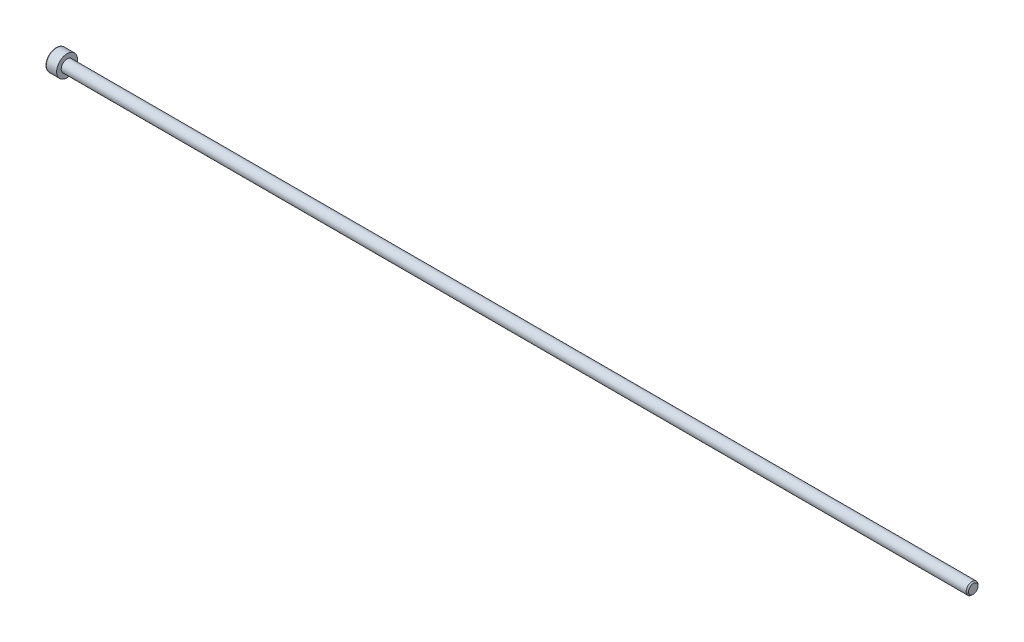
ISO-10303-21;
HEADER;
FILE_DESCRIPTION(('STEP AP214'),'2;1');
FILE_NAME('part.step','',(''),(''),'','','');
FILE_SCHEMA(('AUTOMOTIVE_DESIGN { 1 0 10303 214 1 1 1 1 }'));
ENDSEC;
DATA;
#1=APPLICATION_CONTEXT('core data for automotive mechanical design processes');
#2=APPLICATION_PROTOCOL_DEFINITION('international standard','automotive_design',2000,#1);
#3=PRODUCT_CONTEXT('',#1,'mechanical');
#4=PRODUCT('Part','Part','',(#3));
#5=PRODUCT_RELATED_PRODUCT_CATEGORY('part','',(#4));
#6=PRODUCT_DEFINITION_FORMATION('','',#4);
#7=PRODUCT_DEFINITION_CONTEXT('part definition',#1,'design');
#8=PRODUCT_DEFINITION('design','',#6,#7);
#9=PRODUCT_DEFINITION_SHAPE('','',#8);
#10=(LENGTH_UNIT() NAMED_UNIT(*) SI_UNIT(.MILLI.,.METRE.));
#11=(NAMED_UNIT(*) PLANE_ANGLE_UNIT() SI_UNIT($,.RADIAN.));
#12=(NAMED_UNIT(*) SI_UNIT($,.STERADIAN.) SOLID_ANGLE_UNIT());
#13=UNCERTAINTY_MEASURE_WITH_UNIT(LENGTH_MEASURE(1.E-05),#10,'distance_accuracy_value','');
#14=(GEOMETRIC_REPRESENTATION_CONTEXT(3) GLOBAL_UNCERTAINTY_ASSIGNED_CONTEXT((#13)) GLOBAL_UNIT_ASSIGNED_CONTEXT((#10,
#11,#12)) REPRESENTATION_CONTEXT('',''));
#15=CARTESIAN_POINT('',(0.,0.,0.));
#16=DIRECTION('',(0.,0.,1.));
#17=DIRECTION('',(1.,0.,0.));
#18=AXIS2_PLACEMENT_3D('',#15,#16,#17);
#19=CARTESIAN_POINT('',(0.,2.66,0.));
#20=DIRECTION('',(1.,0.,0.));
#21=DIRECTION('',(0.,1.,0.));
#22=AXIS2_PLACEMENT_3D('',#19,#20,#21);
#23=PLANE('',#22);
#24=CARTESIAN_POINT('',(0.,0.,0.));
#25=DIRECTION('',(-1.,0.,0.));
#26=DIRECTION('',(0.,-1.,0.));
#27=AXIS2_PLACEMENT_3D('',#24,#25,#26);
#28=CIRCLE('',#27,1.5);
#29=CARTESIAN_POINT('',(0.,-1.5,0.));
#30=VERTEX_POINT('',#29);
#31=EDGE_CURVE('E144',#30,#30,#28,.T.);
#32=ORIENTED_EDGE('',*,*,#31,.T.);
#33=EDGE_LOOP('',(#32));
#34=FACE_BOUND('',#33,.T.);
#35=CARTESIAN_POINT('',(0.,0.,0.));
#36=DIRECTION('',(-1.,0.,0.));
#37=DIRECTION('',(0.,-1.,0.));
#38=AXIS2_PLACEMENT_3D('',#35,#36,#37);
#39=CIRCLE('',#38,2.66);
#40=CARTESIAN_POINT('',(0.,-2.66,0.));
#41=VERTEX_POINT('',#40);
#42=EDGE_CURVE('E136',#41,#41,#39,.T.);
#43=ORIENTED_EDGE('',*,*,#42,.F.);
#44=EDGE_LOOP('',(#43));
#45=FACE_BOUND('',#44,.T.);
#46=ADVANCED_FACE('F34',(#34,#45),#23,.T.);
#47=CARTESIAN_POINT('',(0.,0.,0.));
#48=DIRECTION('',(-1.,0.,0.));
#49=DIRECTION('',(0.,-1.,0.));
#50=AXIS2_PLACEMENT_3D('',#47,#48,#49);
#51=CYLINDRICAL_SURFACE('',#50,1.49999999999999);
#52=CARTESIAN_POINT('',(229.6935,0.,0.));
#53=DIRECTION('',(1.,0.,0.));
#54=DIRECTION('',(0.,1.,0.));
#55=AXIS2_PLACEMENT_3D('',#52,#53,#54);
#56=CIRCLE('',#55,1.49999999999999);
#57=CARTESIAN_POINT('',(229.6935,1.49999999999999,0.));
#58=VERTEX_POINT('',#57);
#59=EDGE_CURVE('E42',#58,#58,#56,.F.);
#60=ORIENTED_EDGE('',*,*,#59,.T.);
#61=EDGE_LOOP('',(#60));
#62=FACE_BOUND('',#61,.T.);
#63=ORIENTED_EDGE('',*,*,#31,.F.);
#64=EDGE_LOOP('',(#63));
#65=FACE_BOUND('',#64,.T.);
#66=ADVANCED_FACE('F155',(#62,#65),#51,.T.);
#67=CARTESIAN_POINT('',(230.,0.,0.));
#68=DIRECTION('',(1.,0.,0.));
#69=DIRECTION('',(0.,1.,0.));
#70=AXIS2_PLACEMENT_3D('',#67,#68,#69);
#71=PLANE('',#70);
#72=CARTESIAN_POINT('',(230.,0.,0.));
#73=DIRECTION('',(1.,0.,0.));
#74=DIRECTION('',(0.,1.,0.));
#75=AXIS2_PLACEMENT_3D('',#72,#73,#74);
#76=CIRCLE('',#75,1.19350000000001);
#77=CARTESIAN_POINT('',(230.,1.19350000000001,0.));
#78=VERTEX_POINT('',#77);
#79=EDGE_CURVE('E11',#78,#78,#76,.T.);
#80=ORIENTED_EDGE('',*,*,#79,.T.);
#81=EDGE_LOOP('',(#80));
#82=FACE_BOUND('',#81,.T.);
#83=ADVANCED_FACE('F172',(#82),#71,.T.);
#84=CARTESIAN_POINT('',(-2.86,0.,0.));
#85=DIRECTION('',(-1.,0.,0.));
#86=DIRECTION('',(0.,-1.,0.));
#87=AXIS2_PLACEMENT_3D('',#84,#85,#86);
#88=PLANE('',#87);
#89=CARTESIAN_POINT('',(-2.86,0.,0.));
#90=DIRECTION('',(-1.,0.,0.));
#91=DIRECTION('',(0.,-1.,0.));
#92=AXIS2_PLACEMENT_3D('',#89,#90,#91);
#93=CIRCLE('',#92,2.394);
#94=CARTESIAN_POINT('',(-2.86,-2.394,0.));
#95=VERTEX_POINT('',#94);
#96=EDGE_CURVE('E147',#95,#95,#93,.T.);
#97=ORIENTED_EDGE('',*,*,#96,.T.);
#98=EDGE_LOOP('',(#97));
#99=FACE_BOUND('',#98,.T.);
#100=DIRECTION('',(0.,-1.,0.));
#101=VECTOR('',#100,1.);
#102=CARTESIAN_POINT('',(-2.86,0.721687836487032,-1.25));
#103=LINE('',#102,#101);
#104=CARTESIAN_POINT('',(-2.86,0.721687836487032,-1.25));
#105=VERTEX_POINT('',#104);
#106=CARTESIAN_POINT('',(-2.86,-0.721687836487033,-1.25));
#107=VERTEX_POINT('',#106);
#108=EDGE_CURVE('E49',#105,#107,#103,.T.);
#109=ORIENTED_EDGE('',*,*,#108,.F.);
#110=DIRECTION('',(0.,-0.5,-0.866025403784439));
#111=VECTOR('',#110,1.);
#112=CARTESIAN_POINT('',(-2.86,1.44337567297406,0.));
#113=LINE('',#112,#111);
#114=CARTESIAN_POINT('',(-2.86,1.44337567297406,0.));
#115=VERTEX_POINT('',#114);
#116=EDGE_CURVE('E132',#115,#105,#113,.T.);
#117=ORIENTED_EDGE('',*,*,#116,.F.);
#118=DIRECTION('',(0.,0.499999999999999,-0.866025403784439));
#119=VECTOR('',#118,1.);
#120=CARTESIAN_POINT('',(-2.86,0.721687836487033,1.25));
#121=LINE('',#120,#119);
#122=CARTESIAN_POINT('',(-2.86,0.721687836487033,1.25));
#123=VERTEX_POINT('',#122);
#124=EDGE_CURVE('E130',#123,#115,#121,.T.);
#125=ORIENTED_EDGE('',*,*,#124,.F.);
#126=DIRECTION('',(0.,1.,0.));
#127=VECTOR('',#126,1.);
#128=CARTESIAN_POINT('',(-2.86,-0.721687836487031,1.25));
#129=LINE('',#128,#127);
#130=CARTESIAN_POINT('',(-2.86,-0.721687836487031,1.25));
#131=VERTEX_POINT('',#130);
#132=EDGE_CURVE('E97',#131,#123,#129,.T.);
#133=ORIENTED_EDGE('',*,*,#132,.F.);
#134=DIRECTION('',(0.,0.5,0.866025403784438));
#135=VECTOR('',#134,1.);
#136=CARTESIAN_POINT('',(-2.86,-1.44337567297406,0.));
#137=LINE('',#136,#135);
#138=CARTESIAN_POINT('',(-2.86,-1.44337567297406,0.));
#139=VERTEX_POINT('',#138);
#140=EDGE_CURVE('E126',#139,#131,#137,.T.);
#141=ORIENTED_EDGE('',*,*,#140,.F.);
#142=DIRECTION('',(0.,-0.499999999999999,0.866025403784439));
#143=VECTOR('',#142,1.);
#144=CARTESIAN_POINT('',(-2.86,-0.721687836487033,-1.25));
#145=LINE('',#144,#143);
#146=EDGE_CURVE('E123',#107,#139,#145,.T.);
#147=ORIENTED_EDGE('',*,*,#146,.F.);
#148=EDGE_LOOP('',(#109,#117,#125,#133,#141,#147));
#149=FACE_BOUND('',#148,.T.);
#150=ADVANCED_FACE('F178',(#99,#149),#88,.T.);
#151=CARTESIAN_POINT('',(0.,0.,0.));
#152=DIRECTION('',(-1.,0.,0.));
#153=DIRECTION('',(0.,-1.,0.));
#154=AXIS2_PLACEMENT_3D('',#151,#152,#153);
#155=CYLINDRICAL_SURFACE('',#154,2.66);
#156=CARTESIAN_POINT('',(-2.594,0.,0.));
#157=DIRECTION('',(-1.,0.,0.));
#158=DIRECTION('',(0.,-1.,0.));
#159=AXIS2_PLACEMENT_3D('',#156,#157,#158);
#160=CIRCLE('',#159,2.66);
#161=CARTESIAN_POINT('',(-2.594,-2.66,0.));
#162=VERTEX_POINT('',#161);
#163=EDGE_CURVE('E150',#162,#162,#160,.F.);
#164=ORIENTED_EDGE('',*,*,#163,.T.);
#165=EDGE_LOOP('',(#164));
#166=FACE_BOUND('',#165,.T.);
#167=ORIENTED_EDGE('',*,*,#42,.T.);
#168=EDGE_LOOP('',(#167));
#169=FACE_BOUND('',#168,.T.);
#170=ADVANCED_FACE('F182',(#166,#169),#155,.T.);
#171=CARTESIAN_POINT('',(-1.56,0.721687836487032,-1.25));
#172=DIRECTION('',(0.,0.,-1.));
#173=DIRECTION('',(-1.,0.,0.));
#174=AXIS2_PLACEMENT_3D('',#171,#172,#173);
#175=PLANE('',#174);
#176=ORIENTED_EDGE('',*,*,#108,.T.);
#177=DIRECTION('',(-1.,0.,0.));
#178=VECTOR('',#177,1.);
#179=CARTESIAN_POINT('',(-1.56,-0.721687836487033,-1.25));
#180=LINE('',#179,#178);
#181=CARTESIAN_POINT('',(-1.56,-0.721687836487033,-1.25));
#182=VERTEX_POINT('',#181);
#183=EDGE_CURVE('E79',#182,#107,#180,.T.);
#184=ORIENTED_EDGE('',*,*,#183,.F.);
#185=DIRECTION('',(0.,-1.,0.));
#186=VECTOR('',#185,1.);
#187=CARTESIAN_POINT('',(-1.56,0.721687836487032,-1.25));
#188=LINE('',#187,#186);
#189=CARTESIAN_POINT('',(-1.56,0.721687836487032,-1.25));
#190=VERTEX_POINT('',#189);
#191=EDGE_CURVE('E134',#190,#182,#188,.T.);
#192=ORIENTED_EDGE('',*,*,#191,.F.);
#193=DIRECTION('',(-1.,0.,0.));
#194=VECTOR('',#193,1.);
#195=CARTESIAN_POINT('',(-1.56,0.721687836487032,-1.25));
#196=LINE('',#195,#194);
#197=EDGE_CURVE('E57',#190,#105,#196,.T.);
#198=ORIENTED_EDGE('',*,*,#197,.T.);
#199=EDGE_LOOP('',(#176,#184,#192,#198));
#200=FACE_BOUND('',#199,.T.);
#201=ADVANCED_FACE('F186',(#200),#175,.F.);
#202=CARTESIAN_POINT('',(-1.56,1.44337567297406,0.));
#203=DIRECTION('',(0.,0.866025403784439,-0.5));
#204=DIRECTION('',(0.,0.5,0.866025403784439));
#205=AXIS2_PLACEMENT_3D('',#202,#203,#204);
#206=PLANE('',#205);
#207=ORIENTED_EDGE('',*,*,#116,.T.);
#208=ORIENTED_EDGE('',*,*,#197,.F.);
#209=DIRECTION('',(0.,-0.5,-0.866025403784439));
#210=VECTOR('',#209,1.);
#211=CARTESIAN_POINT('',(-1.56,1.44337567297406,0.));
#212=LINE('',#211,#210);
#213=CARTESIAN_POINT('',(-1.56,1.44337567297406,0.));
#214=VERTEX_POINT('',#213);
#215=EDGE_CURVE('E109',#214,#190,#212,.T.);
#216=ORIENTED_EDGE('',*,*,#215,.F.);
#217=DIRECTION('',(-1.,0.,0.));
#218=VECTOR('',#217,1.);
#219=CARTESIAN_POINT('',(-1.56,1.44337567297406,0.));
#220=LINE('',#219,#218);
#221=EDGE_CURVE('E101',#214,#115,#220,.T.);
#222=ORIENTED_EDGE('',*,*,#221,.T.);
#223=EDGE_LOOP('',(#207,#208,#216,#222));
#224=FACE_BOUND('',#223,.T.);
#225=ADVANCED_FACE('F190',(#224),#206,.F.);
#226=CARTESIAN_POINT('',(-1.56,0.721687836487033,1.25));
#227=DIRECTION('',(0.,0.866025403784439,0.499999999999999));
#228=DIRECTION('',(0.,-0.499999999999999,0.866025403784439));
#229=AXIS2_PLACEMENT_3D('',#226,#227,#228);
#230=PLANE('',#229);
#231=ORIENTED_EDGE('',*,*,#124,.T.);
#232=ORIENTED_EDGE('',*,*,#221,.F.);
#233=DIRECTION('',(0.,0.499999999999999,-0.866025403784439));
#234=VECTOR('',#233,1.);
#235=CARTESIAN_POINT('',(-1.56,0.721687836487033,1.25));
#236=LINE('',#235,#234);
#237=CARTESIAN_POINT('',(-1.56,0.721687836487033,1.25));
#238=VERTEX_POINT('',#237);
#239=EDGE_CURVE('E105',#238,#214,#236,.T.);
#240=ORIENTED_EDGE('',*,*,#239,.F.);
#241=DIRECTION('',(-1.,0.,0.));
#242=VECTOR('',#241,1.);
#243=CARTESIAN_POINT('',(-1.56,0.721687836487033,1.25));
#244=LINE('',#243,#242);
#245=EDGE_CURVE('E90',#238,#123,#244,.T.);
#246=ORIENTED_EDGE('',*,*,#245,.T.);
#247=EDGE_LOOP('',(#231,#232,#240,#246));
#248=FACE_BOUND('',#247,.T.);
#249=ADVANCED_FACE('F106',(#248),#230,.F.);
#250=CARTESIAN_POINT('',(-1.56,-0.721687836487031,1.25));
#251=DIRECTION('',(0.,0.,1.));
#252=DIRECTION('',(1.,0.,0.));
#253=AXIS2_PLACEMENT_3D('',#250,#251,#252);
#254=PLANE('',#253);
#255=ORIENTED_EDGE('',*,*,#132,.T.);
#256=ORIENTED_EDGE('',*,*,#245,.F.);
#257=DIRECTION('',(0.,1.,0.));
#258=VECTOR('',#257,1.);
#259=CARTESIAN_POINT('',(-1.56,-0.721687836487031,1.25));
#260=LINE('',#259,#258);
#261=CARTESIAN_POINT('',(-1.56,-0.721687836487031,1.25));
#262=VERTEX_POINT('',#261);
#263=EDGE_CURVE('E94',#262,#238,#260,.T.);
#264=ORIENTED_EDGE('',*,*,#263,.F.);
#265=DIRECTION('',(-1.,0.,0.));
#266=VECTOR('',#265,1.);
#267=CARTESIAN_POINT('',(-1.56,-0.721687836487031,1.25));
#268=LINE('',#267,#266);
#269=EDGE_CURVE('E102',#262,#131,#268,.T.);
#270=ORIENTED_EDGE('',*,*,#269,.T.);
#271=EDGE_LOOP('',(#255,#256,#264,#270));
#272=FACE_BOUND('',#271,.T.);
#273=ADVANCED_FACE('F92',(#272),#254,.F.);
#274=CARTESIAN_POINT('',(-1.56,-1.44337567297406,0.));
#275=DIRECTION('',(0.,-0.866025403784438,0.5));
#276=DIRECTION('',(0.,-0.5,-0.866025403784438));
#277=AXIS2_PLACEMENT_3D('',#274,#275,#276);
#278=PLANE('',#277);
#279=ORIENTED_EDGE('',*,*,#140,.T.);
#280=ORIENTED_EDGE('',*,*,#269,.F.);
#281=DIRECTION('',(0.,0.5,0.866025403784438));
#282=VECTOR('',#281,1.);
#283=CARTESIAN_POINT('',(-1.56,-1.44337567297406,0.));
#284=LINE('',#283,#282);
#285=CARTESIAN_POINT('',(-1.56,-1.44337567297406,0.));
#286=VERTEX_POINT('',#285);
#287=EDGE_CURVE('E115',#286,#262,#284,.T.);
#288=ORIENTED_EDGE('',*,*,#287,.F.);
#289=DIRECTION('',(-1.,0.,0.));
#290=VECTOR('',#289,1.);
#291=CARTESIAN_POINT('',(-1.56,-1.44337567297406,0.));
#292=LINE('',#291,#290);
#293=EDGE_CURVE('E139',#286,#139,#292,.T.);
#294=ORIENTED_EDGE('',*,*,#293,.T.);
#295=EDGE_LOOP('',(#279,#280,#288,#294));
#296=FACE_BOUND('',#295,.T.);
#297=ADVANCED_FACE('F194',(#296),#278,.F.);
#298=CARTESIAN_POINT('',(-1.56,-0.721687836487033,-1.25));
#299=DIRECTION('',(0.,-0.866025403784439,-0.499999999999999));
#300=DIRECTION('',(0.,0.499999999999999,-0.866025403784439));
#301=AXIS2_PLACEMENT_3D('',#298,#299,#300);
#302=PLANE('',#301);
#303=ORIENTED_EDGE('',*,*,#146,.T.);
#304=ORIENTED_EDGE('',*,*,#293,.F.);
#305=DIRECTION('',(0.,-0.499999999999999,0.866025403784439));
#306=VECTOR('',#305,1.);
#307=CARTESIAN_POINT('',(-1.56,-0.721687836487033,-1.25));
#308=LINE('',#307,#306);
#309=EDGE_CURVE('E117',#182,#286,#308,.T.);
#310=ORIENTED_EDGE('',*,*,#309,.F.);
#311=ORIENTED_EDGE('',*,*,#183,.T.);
#312=EDGE_LOOP('',(#303,#304,#310,#311));
#313=FACE_BOUND('',#312,.T.);
#314=ADVANCED_FACE('F191',(#313),#302,.F.);
#315=CARTESIAN_POINT('',(-1.56,0.,0.));
#316=DIRECTION('',(-1.,0.,0.));
#317=DIRECTION('',(0.,0.,1.));
#318=AXIS2_PLACEMENT_3D('',#315,#316,#317);
#319=PLANE('',#318);
#320=ORIENTED_EDGE('',*,*,#191,.T.);
#321=ORIENTED_EDGE('',*,*,#309,.T.);
#322=ORIENTED_EDGE('',*,*,#287,.T.);
#323=ORIENTED_EDGE('',*,*,#263,.T.);
#324=ORIENTED_EDGE('',*,*,#239,.T.);
#325=ORIENTED_EDGE('',*,*,#215,.T.);
#326=EDGE_LOOP('',(#320,#321,#322,#323,#324,#325));
#327=FACE_BOUND('',#326,.T.);
#328=ADVANCED_FACE('F112',(#327),#319,.T.);
#329=CARTESIAN_POINT('',(-2.594,0.,0.));
#330=DIRECTION('',(-1.,0.,0.));
#331=DIRECTION('',(0.,-1.,0.));
#332=AXIS2_PLACEMENT_3D('',#329,#330,#331);
#333=TOROIDAL_SURFACE('',#332,2.394,0.266);
#334=ORIENTED_EDGE('',*,*,#163,.F.);
#335=EDGE_LOOP('',(#334));
#336=FACE_BOUND('',#335,.T.);
#337=ORIENTED_EDGE('',*,*,#96,.F.);
#338=EDGE_LOOP('',(#337));
#339=FACE_BOUND('',#338,.T.);
#340=ADVANCED_FACE('F159',(#336,#339),#333,.T.);
#341=CARTESIAN_POINT('',(229.6935,0.,0.));
#342=DIRECTION('',(-1.,0.,0.));
#343=DIRECTION('',(0.,-1.,0.));
#344=AXIS2_PLACEMENT_3D('',#341,#342,#343);
#345=CONICAL_SURFACE('',#344,1.49999999999999,0.785398163397437);
#346=ORIENTED_EDGE('',*,*,#79,.F.);
#347=EDGE_LOOP('',(#346));
#348=FACE_BOUND('',#347,.T.);
#349=ORIENTED_EDGE('',*,*,#59,.F.);
#350=EDGE_LOOP('',(#349));
#351=FACE_BOUND('',#350,.T.);
#352=ADVANCED_FACE('F36',(#348,#351),#345,.T.);
#353=CLOSED_SHELL('',(#46,#66,#83,#150,#170,#201,#225,#249,#273,#297,#314,#328,#340,#352));
#354=MANIFOLD_SOLID_BREP('B2',#353);
#355=ADVANCED_BREP_SHAPE_REPRESENTATION('',(#18,#354),#14);
#356=SHAPE_DEFINITION_REPRESENTATION(#9,#355);
ENDSEC;
END-ISO-10303-21;
